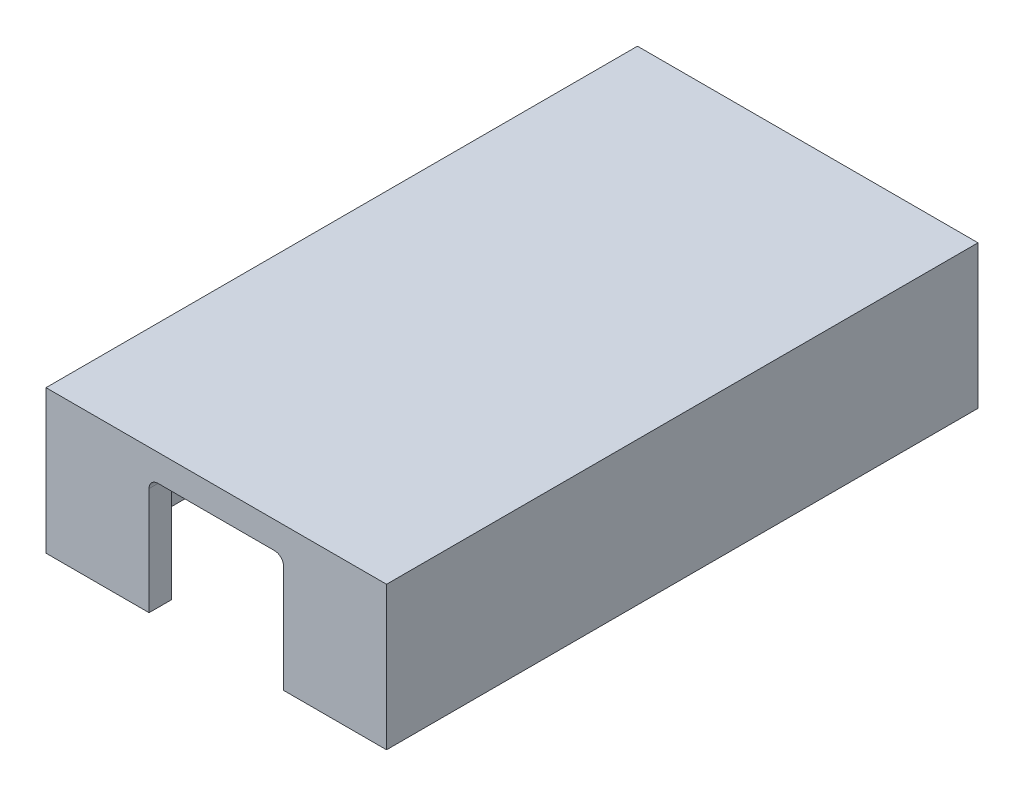
ISO-10303-21;
HEADER;
FILE_DESCRIPTION(('STEP AP214'),'2;1');
FILE_NAME('part.step','',(''),(''),'','','');
FILE_SCHEMA(('AUTOMOTIVE_DESIGN { 1 0 10303 214 1 1 1 1 }'));
ENDSEC;
DATA;
#1=APPLICATION_CONTEXT('core data for automotive mechanical design processes');
#2=APPLICATION_PROTOCOL_DEFINITION('international standard','automotive_design',2000,#1);
#3=PRODUCT_CONTEXT('',#1,'mechanical');
#4=PRODUCT('Part','Part','',(#3));
#5=PRODUCT_RELATED_PRODUCT_CATEGORY('part','',(#4));
#6=PRODUCT_DEFINITION_FORMATION('','',#4);
#7=PRODUCT_DEFINITION_CONTEXT('part definition',#1,'design');
#8=PRODUCT_DEFINITION('design','',#6,#7);
#9=PRODUCT_DEFINITION_SHAPE('','',#8);
#10=(LENGTH_UNIT() NAMED_UNIT(*) SI_UNIT(.MILLI.,.METRE.));
#11=(NAMED_UNIT(*) PLANE_ANGLE_UNIT() SI_UNIT($,.RADIAN.));
#12=(NAMED_UNIT(*) SI_UNIT($,.STERADIAN.) SOLID_ANGLE_UNIT());
#13=UNCERTAINTY_MEASURE_WITH_UNIT(LENGTH_MEASURE(1.E-05),#10,'distance_accuracy_value','');
#14=(GEOMETRIC_REPRESENTATION_CONTEXT(3) GLOBAL_UNCERTAINTY_ASSIGNED_CONTEXT((#13)) GLOBAL_UNIT_ASSIGNED_CONTEXT((#10,
#11,#12)) REPRESENTATION_CONTEXT('',''));
#15=CARTESIAN_POINT('',(0.,0.,0.));
#16=DIRECTION('',(0.,0.,1.));
#17=DIRECTION('',(1.,0.,0.));
#18=AXIS2_PLACEMENT_3D('',#15,#16,#17);
#19=CARTESIAN_POINT('',(16.5,-13.,-30.5));
#20=DIRECTION('',(-1.,0.,0.));
#21=DIRECTION('',(0.,0.,1.));
#22=AXIS2_PLACEMENT_3D('',#19,#20,#21);
#23=PLANE('',#22);
#24=DIRECTION('',(0.,1.,0.));
#25=VECTOR('',#24,1.);
#26=CARTESIAN_POINT('',(16.5,-13.,30.5));
#27=LINE('',#26,#25);
#28=CARTESIAN_POINT('',(16.5,-13.,30.5));
#29=VERTEX_POINT('',#28);
#30=CARTESIAN_POINT('',(16.5,-1.,30.5));
#31=VERTEX_POINT('',#30);
#32=EDGE_CURVE('E378',#29,#31,#27,.T.);
#33=ORIENTED_EDGE('',*,*,#32,.T.);
#34=DIRECTION('',(0.,0.,1.));
#35=VECTOR('',#34,1.);
#36=CARTESIAN_POINT('',(16.5,-0.999999999999999,-30.5));
#37=LINE('',#36,#35);
#38=CARTESIAN_POINT('',(16.5,-1.,-30.5));
#39=VERTEX_POINT('',#38);
#40=EDGE_CURVE('E439',#31,#39,#37,.F.);
#41=ORIENTED_EDGE('',*,*,#40,.T.);
#42=DIRECTION('',(0.,1.,0.));
#43=VECTOR('',#42,1.);
#44=CARTESIAN_POINT('',(16.5,-13.,-30.5));
#45=LINE('',#44,#43);
#46=CARTESIAN_POINT('',(16.5,-13.,-30.5));
#47=VERTEX_POINT('',#46);
#48=EDGE_CURVE('E381',#47,#39,#45,.T.);
#49=ORIENTED_EDGE('',*,*,#48,.F.);
#50=DIRECTION('',(0.,0.,1.));
#51=VECTOR('',#50,1.);
#52=CARTESIAN_POINT('',(16.5,-13.,-30.5));
#53=LINE('',#52,#51);
#54=CARTESIAN_POINT('',(16.5,-13.,-7.50000000000001));
#55=VERTEX_POINT('',#54);
#56=EDGE_CURVE('E361',#47,#55,#53,.T.);
#57=ORIENTED_EDGE('',*,*,#56,.T.);
#58=DIRECTION('',(0.,-1.,0.));
#59=VECTOR('',#58,1.);
#60=CARTESIAN_POINT('',(16.5,-13.,-7.5));
#61=LINE('',#60,#59);
#62=CARTESIAN_POINT('',(16.5,-11.5,-7.5));
#63=VERTEX_POINT('',#62);
#64=EDGE_CURVE('E254',#63,#55,#61,.T.);
#65=ORIENTED_EDGE('',*,*,#64,.F.);
#66=DIRECTION('',(0.,0.,-1.));
#67=VECTOR('',#66,1.);
#68=CARTESIAN_POINT('',(16.5,-11.5,-7.5));
#69=LINE('',#68,#67);
#70=CARTESIAN_POINT('',(16.5,-11.5,7.5));
#71=VERTEX_POINT('',#70);
#72=EDGE_CURVE('E287',#71,#63,#69,.T.);
#73=ORIENTED_EDGE('',*,*,#72,.F.);
#74=DIRECTION('',(0.,1.,0.));
#75=VECTOR('',#74,1.);
#76=CARTESIAN_POINT('',(16.5,-13.,7.5));
#77=LINE('',#76,#75);
#78=CARTESIAN_POINT('',(16.5,-13.,7.5));
#79=VERTEX_POINT('',#78);
#80=EDGE_CURVE('E294',#79,#71,#77,.T.);
#81=ORIENTED_EDGE('',*,*,#80,.F.);
#82=EDGE_CURVE('E360',#79,#29,#53,.T.);
#83=ORIENTED_EDGE('',*,*,#82,.T.);
#84=EDGE_LOOP('',(#33,#41,#49,#57,#65,#73,#81,#83));
#85=FACE_BOUND('',#84,.T.);
#86=ADVANCED_FACE('F32',(#85),#23,.T.);
#87=CARTESIAN_POINT('',(-19.,3.,-33.));
#88=DIRECTION('',(1.,0.,0.));
#89=DIRECTION('',(0.,0.,-1.));
#90=AXIS2_PLACEMENT_3D('',#87,#88,#89);
#91=PLANE('',#90);
#92=DIRECTION('',(0.,-1.,0.));
#93=VECTOR('',#92,1.);
#94=CARTESIAN_POINT('',(-19.,3.,-33.));
#95=LINE('',#94,#93);
#96=CARTESIAN_POINT('',(-19.,3.,-33.));
#97=VERTEX_POINT('',#96);
#98=CARTESIAN_POINT('',(-19.,-13.,-33.));
#99=VERTEX_POINT('',#98);
#100=EDGE_CURVE('E397',#97,#99,#95,.T.);
#101=ORIENTED_EDGE('',*,*,#100,.T.);
#102=DIRECTION('',(0.,0.,1.));
#103=VECTOR('',#102,1.);
#104=CARTESIAN_POINT('',(-19.,-13.,-33.));
#105=LINE('',#104,#103);
#106=CARTESIAN_POINT('',(-19.,-13.,33.));
#107=VERTEX_POINT('',#106);
#108=EDGE_CURVE('E330',#99,#107,#105,.T.);
#109=ORIENTED_EDGE('',*,*,#108,.T.);
#110=DIRECTION('',(0.,-1.,0.));
#111=VECTOR('',#110,1.);
#112=CARTESIAN_POINT('',(-19.,3.,33.));
#113=LINE('',#112,#111);
#114=CARTESIAN_POINT('',(-19.,3.,33.));
#115=VERTEX_POINT('',#114);
#116=EDGE_CURVE('E549',#115,#107,#113,.T.);
#117=ORIENTED_EDGE('',*,*,#116,.F.);
#118=DIRECTION('',(0.,0.,1.));
#119=VECTOR('',#118,1.);
#120=CARTESIAN_POINT('',(-19.,3.,-33.));
#121=LINE('',#120,#119);
#122=EDGE_CURVE('E387',#97,#115,#121,.T.);
#123=ORIENTED_EDGE('',*,*,#122,.F.);
#124=EDGE_LOOP('',(#101,#109,#117,#123));
#125=FACE_BOUND('',#124,.T.);
#126=ADVANCED_FACE('F610',(#125),#91,.F.);
#127=CARTESIAN_POINT('',(-19.,3.,33.));
#128=DIRECTION('',(0.,0.,-1.));
#129=DIRECTION('',(-1.,0.,0.));
#130=AXIS2_PLACEMENT_3D('',#127,#128,#129);
#131=PLANE('',#130);
#132=ORIENTED_EDGE('',*,*,#116,.T.);
#133=DIRECTION('',(1.,0.,0.));
#134=VECTOR('',#133,1.);
#135=CARTESIAN_POINT('',(-7.49999999999999,-13.,33.));
#136=LINE('',#135,#134);
#137=CARTESIAN_POINT('',(-7.49999999999999,-13.,33.));
#138=VERTEX_POINT('',#137);
#139=EDGE_CURVE('E308',#107,#138,#136,.T.);
#140=ORIENTED_EDGE('',*,*,#139,.T.);
#141=DIRECTION('',(0.,1.,0.));
#142=VECTOR('',#141,1.);
#143=CARTESIAN_POINT('',(-7.49999999999999,-13.,33.));
#144=LINE('',#143,#142);
#145=CARTESIAN_POINT('',(-7.49999999999999,-1.,33.));
#146=VERTEX_POINT('',#145);
#147=EDGE_CURVE('E333',#138,#146,#144,.T.);
#148=ORIENTED_EDGE('',*,*,#147,.T.);
#149=CARTESIAN_POINT('',(-6.49999999999999,-1.,33.));
#150=DIRECTION('',(0.,0.,-1.));
#151=DIRECTION('',(-1.,0.,0.));
#152=AXIS2_PLACEMENT_3D('',#149,#150,#151);
#153=CIRCLE('',#152,1.);
#154=CARTESIAN_POINT('',(-6.49999999999999,0.,33.));
#155=VERTEX_POINT('',#154);
#156=EDGE_CURVE('E11',#146,#155,#153,.T.);
#157=ORIENTED_EDGE('',*,*,#156,.T.);
#158=DIRECTION('',(1.,0.,0.));
#159=VECTOR('',#158,1.);
#160=CARTESIAN_POINT('',(-19.,0.,33.));
#161=LINE('',#160,#159);
#162=CARTESIAN_POINT('',(6.50000000000001,0.,33.));
#163=VERTEX_POINT('',#162);
#164=EDGE_CURVE('E403',#155,#163,#161,.T.);
#165=ORIENTED_EDGE('',*,*,#164,.T.);
#166=CARTESIAN_POINT('',(6.50000000000001,-1.,33.));
#167=DIRECTION('',(0.,0.,-1.));
#168=DIRECTION('',(-1.,0.,0.));
#169=AXIS2_PLACEMENT_3D('',#166,#167,#168);
#170=CIRCLE('',#169,1.);
#171=CARTESIAN_POINT('',(7.50000000000001,-1.,33.));
#172=VERTEX_POINT('',#171);
#173=EDGE_CURVE('E41',#163,#172,#170,.T.);
#174=ORIENTED_EDGE('',*,*,#173,.T.);
#175=DIRECTION('',(0.,1.,0.));
#176=VECTOR('',#175,1.);
#177=CARTESIAN_POINT('',(7.50000000000001,-13.,33.));
#178=LINE('',#177,#176);
#179=CARTESIAN_POINT('',(7.50000000000001,-13.,33.));
#180=VERTEX_POINT('',#179);
#181=EDGE_CURVE('E377',#180,#172,#178,.T.);
#182=ORIENTED_EDGE('',*,*,#181,.F.);
#183=DIRECTION('',(1.,0.,0.));
#184=VECTOR('',#183,1.);
#185=CARTESIAN_POINT('',(19.,-13.,33.));
#186=LINE('',#185,#184);
#187=CARTESIAN_POINT('',(19.,-13.,33.));
#188=VERTEX_POINT('',#187);
#189=EDGE_CURVE('E370',#180,#188,#186,.T.);
#190=ORIENTED_EDGE('',*,*,#189,.T.);
#191=DIRECTION('',(0.,-1.,0.));
#192=VECTOR('',#191,1.);
#193=CARTESIAN_POINT('',(19.,3.,33.));
#194=LINE('',#193,#192);
#195=CARTESIAN_POINT('',(19.,3.,33.));
#196=VERTEX_POINT('',#195);
#197=EDGE_CURVE('E547',#196,#188,#194,.T.);
#198=ORIENTED_EDGE('',*,*,#197,.F.);
#199=DIRECTION('',(1.,0.,0.));
#200=VECTOR('',#199,1.);
#201=CARTESIAN_POINT('',(-19.,3.,33.));
#202=LINE('',#201,#200);
#203=EDGE_CURVE('E390',#115,#196,#202,.T.);
#204=ORIENTED_EDGE('',*,*,#203,.F.);
#205=EDGE_LOOP('',(#132,#140,#148,#157,#165,#174,#182,#190,#198,#204));
#206=FACE_BOUND('',#205,.T.);
#207=ADVANCED_FACE('F491',(#206),#131,.F.);
#208=CARTESIAN_POINT('',(19.,3.,-33.));
#209=DIRECTION('',(-1.,0.,0.));
#210=DIRECTION('',(0.,0.,1.));
#211=AXIS2_PLACEMENT_3D('',#208,#209,#210);
#212=PLANE('',#211);
#213=ORIENTED_EDGE('',*,*,#197,.T.);
#214=DIRECTION('',(0.,0.,-1.));
#215=VECTOR('',#214,1.);
#216=CARTESIAN_POINT('',(19.,-13.,-33.));
#217=LINE('',#216,#215);
#218=CARTESIAN_POINT('',(19.,-13.,-33.));
#219=VERTEX_POINT('',#218);
#220=EDGE_CURVE('E337',#188,#219,#217,.T.);
#221=ORIENTED_EDGE('',*,*,#220,.T.);
#222=DIRECTION('',(0.,-1.,0.));
#223=VECTOR('',#222,1.);
#224=CARTESIAN_POINT('',(19.,3.,-33.));
#225=LINE('',#224,#223);
#226=CARTESIAN_POINT('',(19.,3.,-33.));
#227=VERTEX_POINT('',#226);
#228=EDGE_CURVE('E543',#227,#219,#225,.T.);
#229=ORIENTED_EDGE('',*,*,#228,.F.);
#230=DIRECTION('',(0.,0.,-1.));
#231=VECTOR('',#230,1.);
#232=CARTESIAN_POINT('',(19.,3.,-33.));
#233=LINE('',#232,#231);
#234=EDGE_CURVE('E393',#196,#227,#233,.T.);
#235=ORIENTED_EDGE('',*,*,#234,.F.);
#236=EDGE_LOOP('',(#213,#221,#229,#235));
#237=FACE_BOUND('',#236,.T.);
#238=ADVANCED_FACE('F604',(#237),#212,.F.);
#239=CARTESIAN_POINT('',(-19.,3.,-33.));
#240=DIRECTION('',(0.,0.,1.));
#241=DIRECTION('',(1.,0.,0.));
#242=AXIS2_PLACEMENT_3D('',#239,#240,#241);
#243=PLANE('',#242);
#244=ORIENTED_EDGE('',*,*,#228,.T.);
#245=DIRECTION('',(-1.,0.,0.));
#246=VECTOR('',#245,1.);
#247=CARTESIAN_POINT('',(19.,-13.,-33.));
#248=LINE('',#247,#246);
#249=CARTESIAN_POINT('',(2.5,-13.,-33.));
#250=VERTEX_POINT('',#249);
#251=EDGE_CURVE('E351',#219,#250,#248,.T.);
#252=ORIENTED_EDGE('',*,*,#251,.T.);
#253=DIRECTION('',(0.,1.,0.));
#254=VECTOR('',#253,1.);
#255=CARTESIAN_POINT('',(2.5,-13.,-33.));
#256=LINE('',#255,#254);
#257=CARTESIAN_POINT('',(2.5,-1.,-33.));
#258=VERTEX_POINT('',#257);
#259=EDGE_CURVE('E373',#250,#258,#256,.T.);
#260=ORIENTED_EDGE('',*,*,#259,.T.);
#261=CARTESIAN_POINT('',(1.5,-1.,-33.));
#262=DIRECTION('',(0.,0.,1.));
#263=DIRECTION('',(1.,0.,0.));
#264=AXIS2_PLACEMENT_3D('',#261,#262,#263);
#265=CIRCLE('',#264,1.);
#266=CARTESIAN_POINT('',(1.5,0.,-33.));
#267=VERTEX_POINT('',#266);
#268=EDGE_CURVE('E451',#258,#267,#265,.T.);
#269=ORIENTED_EDGE('',*,*,#268,.T.);
#270=DIRECTION('',(-1.,0.,0.));
#271=VECTOR('',#270,1.);
#272=CARTESIAN_POINT('',(-19.,0.,-33.));
#273=LINE('',#272,#271);
#274=CARTESIAN_POINT('',(-7.5,0.,-33.));
#275=VERTEX_POINT('',#274);
#276=EDGE_CURVE('E391',#267,#275,#273,.T.);
#277=ORIENTED_EDGE('',*,*,#276,.T.);
#278=CARTESIAN_POINT('',(-7.5,-1.,-33.));
#279=DIRECTION('',(0.,0.,1.));
#280=DIRECTION('',(1.,0.,0.));
#281=AXIS2_PLACEMENT_3D('',#278,#279,#280);
#282=CIRCLE('',#281,1.);
#283=CARTESIAN_POINT('',(-8.5,-1.,-33.));
#284=VERTEX_POINT('',#283);
#285=EDGE_CURVE('E449',#275,#284,#282,.T.);
#286=ORIENTED_EDGE('',*,*,#285,.T.);
#287=DIRECTION('',(0.,1.,0.));
#288=VECTOR('',#287,1.);
#289=CARTESIAN_POINT('',(-8.5,-13.,-33.));
#290=LINE('',#289,#288);
#291=CARTESIAN_POINT('',(-8.5,-13.,-33.));
#292=VERTEX_POINT('',#291);
#293=EDGE_CURVE('E334',#292,#284,#290,.T.);
#294=ORIENTED_EDGE('',*,*,#293,.F.);
#295=DIRECTION('',(-1.,0.,0.));
#296=VECTOR('',#295,1.);
#297=CARTESIAN_POINT('',(-8.5,-13.,-33.));
#298=LINE('',#297,#296);
#299=EDGE_CURVE('E327',#292,#99,#298,.T.);
#300=ORIENTED_EDGE('',*,*,#299,.T.);
#301=ORIENTED_EDGE('',*,*,#100,.F.);
#302=DIRECTION('',(-1.,0.,0.));
#303=VECTOR('',#302,1.);
#304=CARTESIAN_POINT('',(-19.,3.,-33.));
#305=LINE('',#304,#303);
#306=EDGE_CURVE('E395',#227,#97,#305,.T.);
#307=ORIENTED_EDGE('',*,*,#306,.F.);
#308=EDGE_LOOP('',(#244,#252,#260,#269,#277,#286,#294,#300,#301,#307));
#309=FACE_BOUND('',#308,.T.);
#310=ADVANCED_FACE('F516',(#309),#243,.F.);
#311=CARTESIAN_POINT('',(0.,3.,0.));
#312=DIRECTION('',(0.,1.,0.));
#313=DIRECTION('',(0.,0.,1.));
#314=AXIS2_PLACEMENT_3D('',#311,#312,#313);
#315=PLANE('',#314);
#316=ORIENTED_EDGE('',*,*,#122,.T.);
#317=ORIENTED_EDGE('',*,*,#203,.T.);
#318=ORIENTED_EDGE('',*,*,#234,.T.);
#319=ORIENTED_EDGE('',*,*,#306,.T.);
#320=EDGE_LOOP('',(#316,#317,#318,#319));
#321=FACE_BOUND('',#320,.T.);
#322=ADVANCED_FACE('F606',(#321),#315,.T.);
#323=CARTESIAN_POINT('',(0.,0.,0.));
#324=DIRECTION('',(0.,1.,0.));
#325=DIRECTION('',(0.,0.,1.));
#326=AXIS2_PLACEMENT_3D('',#323,#324,#325);
#327=PLANE('',#326);
#328=ORIENTED_EDGE('',*,*,#276,.F.);
#329=DIRECTION('',(0.,0.,1.));
#330=VECTOR('',#329,1.);
#331=CARTESIAN_POINT('',(1.5,0.,0.));
#332=LINE('',#331,#330);
#333=CARTESIAN_POINT('',(1.5,0.,-29.5));
#334=VERTEX_POINT('',#333);
#335=EDGE_CURVE('E428',#267,#334,#332,.T.);
#336=ORIENTED_EDGE('',*,*,#335,.T.);
#337=DIRECTION('',(1.,0.,0.));
#338=VECTOR('',#337,1.);
#339=CARTESIAN_POINT('',(0.,0.,-29.5));
#340=LINE('',#339,#338);
#341=CARTESIAN_POINT('',(15.5,0.,-29.5));
#342=VERTEX_POINT('',#341);
#343=EDGE_CURVE('E426',#334,#342,#340,.T.);
#344=ORIENTED_EDGE('',*,*,#343,.T.);
#345=DIRECTION('',(0.,0.,1.));
#346=VECTOR('',#345,1.);
#347=CARTESIAN_POINT('',(15.5,0.,0.));
#348=LINE('',#347,#346);
#349=CARTESIAN_POINT('',(15.5,0.,29.5));
#350=VERTEX_POINT('',#349);
#351=EDGE_CURVE('E424',#342,#350,#348,.T.);
#352=ORIENTED_EDGE('',*,*,#351,.T.);
#353=DIRECTION('',(-1.,0.,0.));
#354=VECTOR('',#353,1.);
#355=CARTESIAN_POINT('',(0.,0.,29.5));
#356=LINE('',#355,#354);
#357=CARTESIAN_POINT('',(6.50000000000001,0.,29.5));
#358=VERTEX_POINT('',#357);
#359=EDGE_CURVE('E420',#350,#358,#356,.T.);
#360=ORIENTED_EDGE('',*,*,#359,.T.);
#361=DIRECTION('',(0.,0.,1.));
#362=VECTOR('',#361,1.);
#363=CARTESIAN_POINT('',(6.50000000000001,0.,0.));
#364=LINE('',#363,#362);
#365=EDGE_CURVE('E422',#358,#163,#364,.T.);
#366=ORIENTED_EDGE('',*,*,#365,.T.);
#367=ORIENTED_EDGE('',*,*,#164,.F.);
#368=DIRECTION('',(0.,0.,-1.));
#369=VECTOR('',#368,1.);
#370=CARTESIAN_POINT('',(-6.49999999999999,0.,0.));
#371=LINE('',#370,#369);
#372=CARTESIAN_POINT('',(-6.49999999999999,0.,29.5));
#373=VERTEX_POINT('',#372);
#374=EDGE_CURVE('E408',#155,#373,#371,.T.);
#375=ORIENTED_EDGE('',*,*,#374,.T.);
#376=DIRECTION('',(-1.,0.,0.));
#377=VECTOR('',#376,1.);
#378=CARTESIAN_POINT('',(0.,0.,29.5));
#379=LINE('',#378,#377);
#380=CARTESIAN_POINT('',(-15.5,0.,29.5));
#381=VERTEX_POINT('',#380);
#382=EDGE_CURVE('E410',#373,#381,#379,.T.);
#383=ORIENTED_EDGE('',*,*,#382,.T.);
#384=DIRECTION('',(0.,0.,-1.));
#385=VECTOR('',#384,1.);
#386=CARTESIAN_POINT('',(-15.5,0.,0.));
#387=LINE('',#386,#385);
#388=CARTESIAN_POINT('',(-15.5,0.,-29.5));
#389=VERTEX_POINT('',#388);
#390=EDGE_CURVE('E413',#381,#389,#387,.T.);
#391=ORIENTED_EDGE('',*,*,#390,.T.);
#392=DIRECTION('',(1.,0.,0.));
#393=VECTOR('',#392,1.);
#394=CARTESIAN_POINT('',(0.,0.,-29.5));
#395=LINE('',#394,#393);
#396=CARTESIAN_POINT('',(-7.5,0.,-29.5));
#397=VERTEX_POINT('',#396);
#398=EDGE_CURVE('E415',#389,#397,#395,.T.);
#399=ORIENTED_EDGE('',*,*,#398,.T.);
#400=DIRECTION('',(0.,0.,-1.));
#401=VECTOR('',#400,1.);
#402=CARTESIAN_POINT('',(-7.5,0.,0.));
#403=LINE('',#402,#401);
#404=EDGE_CURVE('E417',#397,#275,#403,.T.);
#405=ORIENTED_EDGE('',*,*,#404,.T.);
#406=EDGE_LOOP('',(#328,#336,#344,#352,#360,#366,#367,#375,#383,#391,#399,#405));
#407=FACE_BOUND('',#406,.T.);
#408=ADVANCED_FACE('F488',(#407),#327,.F.);
#409=CARTESIAN_POINT('',(7.50000000000001,-13.,33.));
#410=DIRECTION('',(-1.,0.,0.));
#411=DIRECTION('',(0.,0.,1.));
#412=AXIS2_PLACEMENT_3D('',#409,#410,#411);
#413=PLANE('',#412);
#414=ORIENTED_EDGE('',*,*,#181,.T.);
#415=DIRECTION('',(0.,0.,1.));
#416=VECTOR('',#415,1.);
#417=CARTESIAN_POINT('',(7.50000000000001,-0.999999999999999,33.));
#418=LINE('',#417,#416);
#419=CARTESIAN_POINT('',(7.50000000000001,-1.,30.5));
#420=VERTEX_POINT('',#419);
#421=EDGE_CURVE('E441',#172,#420,#418,.F.);
#422=ORIENTED_EDGE('',*,*,#421,.T.);
#423=DIRECTION('',(0.,1.,0.));
#424=VECTOR('',#423,1.);
#425=CARTESIAN_POINT('',(7.50000000000001,-13.,30.5));
#426=LINE('',#425,#424);
#427=CARTESIAN_POINT('',(7.50000000000001,-13.,30.5));
#428=VERTEX_POINT('',#427);
#429=EDGE_CURVE('E374',#428,#420,#426,.T.);
#430=ORIENTED_EDGE('',*,*,#429,.F.);
#431=DIRECTION('',(0.,0.,1.));
#432=VECTOR('',#431,1.);
#433=CARTESIAN_POINT('',(7.50000000000001,-13.,33.));
#434=LINE('',#433,#432);
#435=EDGE_CURVE('E367',#428,#180,#434,.T.);
#436=ORIENTED_EDGE('',*,*,#435,.T.);
#437=EDGE_LOOP('',(#414,#422,#430,#436));
#438=FACE_BOUND('',#437,.T.);
#439=ADVANCED_FACE('F601',(#438),#413,.T.);
#440=CARTESIAN_POINT('',(16.5,-13.,30.5));
#441=DIRECTION('',(0.,0.,-1.));
#442=DIRECTION('',(-1.,0.,0.));
#443=AXIS2_PLACEMENT_3D('',#440,#441,#442);
#444=PLANE('',#443);
#445=ORIENTED_EDGE('',*,*,#429,.T.);
#446=DIRECTION('',(-1.,0.,0.));
#447=VECTOR('',#446,1.);
#448=CARTESIAN_POINT('',(16.5,-0.999999999999999,30.5));
#449=LINE('',#448,#447);
#450=EDGE_CURVE('E443',#420,#31,#449,.F.);
#451=ORIENTED_EDGE('',*,*,#450,.T.);
#452=ORIENTED_EDGE('',*,*,#32,.F.);
#453=DIRECTION('',(-1.,0.,0.));
#454=VECTOR('',#453,1.);
#455=CARTESIAN_POINT('',(16.5,-13.,30.5));
#456=LINE('',#455,#454);
#457=EDGE_CURVE('E364',#29,#428,#456,.T.);
#458=ORIENTED_EDGE('',*,*,#457,.T.);
#459=EDGE_LOOP('',(#445,#451,#452,#458));
#460=FACE_BOUND('',#459,.T.);
#461=ADVANCED_FACE('F599',(#460),#444,.T.);
#462=CARTESIAN_POINT('',(16.5,-13.,-30.5));
#463=DIRECTION('',(0.,0.,1.));
#464=DIRECTION('',(1.,0.,0.));
#465=AXIS2_PLACEMENT_3D('',#462,#463,#464);
#466=PLANE('',#465);
#467=ORIENTED_EDGE('',*,*,#48,.T.);
#468=DIRECTION('',(1.,0.,0.));
#469=VECTOR('',#468,1.);
#470=CARTESIAN_POINT('',(16.5,-0.999999999999999,-30.5));
#471=LINE('',#470,#469);
#472=CARTESIAN_POINT('',(2.5,-1.,-30.5));
#473=VERTEX_POINT('',#472);
#474=EDGE_CURVE('E437',#39,#473,#471,.F.);
#475=ORIENTED_EDGE('',*,*,#474,.T.);
#476=DIRECTION('',(0.,1.,0.));
#477=VECTOR('',#476,1.);
#478=CARTESIAN_POINT('',(2.5,-13.,-30.5));
#479=LINE('',#478,#477);
#480=CARTESIAN_POINT('',(2.5,-13.,-30.5));
#481=VERTEX_POINT('',#480);
#482=EDGE_CURVE('E384',#481,#473,#479,.T.);
#483=ORIENTED_EDGE('',*,*,#482,.F.);
#484=DIRECTION('',(1.,0.,0.));
#485=VECTOR('',#484,1.);
#486=CARTESIAN_POINT('',(16.5,-13.,-30.5));
#487=LINE('',#486,#485);
#488=EDGE_CURVE('E357',#481,#47,#487,.T.);
#489=ORIENTED_EDGE('',*,*,#488,.T.);
#490=EDGE_LOOP('',(#467,#475,#483,#489));
#491=FACE_BOUND('',#490,.T.);
#492=ADVANCED_FACE('F530',(#491),#466,.T.);
#493=CARTESIAN_POINT('',(2.5,-13.,-30.5));
#494=DIRECTION('',(-1.,0.,0.));
#495=DIRECTION('',(0.,0.,1.));
#496=AXIS2_PLACEMENT_3D('',#493,#494,#495);
#497=PLANE('',#496);
#498=ORIENTED_EDGE('',*,*,#482,.T.);
#499=DIRECTION('',(0.,0.,1.));
#500=VECTOR('',#499,1.);
#501=CARTESIAN_POINT('',(2.5,-0.999999999999999,-30.5));
#502=LINE('',#501,#500);
#503=EDGE_CURVE('E433',#473,#258,#502,.F.);
#504=ORIENTED_EDGE('',*,*,#503,.T.);
#505=ORIENTED_EDGE('',*,*,#259,.F.);
#506=DIRECTION('',(0.,0.,1.));
#507=VECTOR('',#506,1.);
#508=CARTESIAN_POINT('',(2.5,-13.,-30.5));
#509=LINE('',#508,#507);
#510=EDGE_CURVE('E354',#250,#481,#509,.T.);
#511=ORIENTED_EDGE('',*,*,#510,.T.);
#512=EDGE_LOOP('',(#498,#504,#505,#511));
#513=FACE_BOUND('',#512,.T.);
#514=ADVANCED_FACE('F533',(#513),#497,.T.);
#515=CARTESIAN_POINT('',(0.,-13.,0.));
#516=DIRECTION('',(0.,-1.,0.));
#517=DIRECTION('',(0.,0.,-1.));
#518=AXIS2_PLACEMENT_3D('',#515,#516,#517);
#519=PLANE('',#518);
#520=DIRECTION('',(1.,0.,0.));
#521=VECTOR('',#520,1.);
#522=CARTESIAN_POINT('',(15.,-13.,7.5));
#523=LINE('',#522,#521);
#524=CARTESIAN_POINT('',(16.,-13.,7.5));
#525=VERTEX_POINT('',#524);
#526=EDGE_CURVE('E304',#525,#79,#523,.T.);
#527=ORIENTED_EDGE('',*,*,#526,.F.);
#528=DIRECTION('',(0.,0.,1.));
#529=VECTOR('',#528,1.);
#530=CARTESIAN_POINT('',(16.,-13.,-7.5));
#531=LINE('',#530,#529);
#532=CARTESIAN_POINT('',(16.,-13.,-7.5));
#533=VERTEX_POINT('',#532);
#534=EDGE_CURVE('E572',#525,#533,#531,.F.);
#535=ORIENTED_EDGE('',*,*,#534,.T.);
#536=DIRECTION('',(1.,0.,0.));
#537=VECTOR('',#536,1.);
#538=CARTESIAN_POINT('',(15.,-13.,-7.5));
#539=LINE('',#538,#537);
#540=EDGE_CURVE('E306',#533,#55,#539,.T.);
#541=ORIENTED_EDGE('',*,*,#540,.T.);
#542=ORIENTED_EDGE('',*,*,#56,.F.);
#543=ORIENTED_EDGE('',*,*,#488,.F.);
#544=ORIENTED_EDGE('',*,*,#510,.F.);
#545=ORIENTED_EDGE('',*,*,#251,.F.);
#546=ORIENTED_EDGE('',*,*,#220,.F.);
#547=ORIENTED_EDGE('',*,*,#189,.F.);
#548=ORIENTED_EDGE('',*,*,#435,.F.);
#549=ORIENTED_EDGE('',*,*,#457,.F.);
#550=ORIENTED_EDGE('',*,*,#82,.F.);
#551=EDGE_LOOP('',(#527,#535,#541,#542,#543,#544,#545,#546,#547,#548,#549,#550));
#552=FACE_BOUND('',#551,.T.);
#553=ADVANCED_FACE('F538',(#552),#519,.T.);
#554=CARTESIAN_POINT('',(-8.5,-13.,-30.5));
#555=DIRECTION('',(1.,0.,0.));
#556=DIRECTION('',(0.,0.,-1.));
#557=AXIS2_PLACEMENT_3D('',#554,#555,#556);
#558=PLANE('',#557);
#559=ORIENTED_EDGE('',*,*,#293,.T.);
#560=DIRECTION('',(0.,0.,-1.));
#561=VECTOR('',#560,1.);
#562=CARTESIAN_POINT('',(-8.5,-0.999999999999999,-30.5));
#563=LINE('',#562,#561);
#564=CARTESIAN_POINT('',(-8.5,-1.,-30.5));
#565=VERTEX_POINT('',#564);
#566=EDGE_CURVE('E431',#284,#565,#563,.F.);
#567=ORIENTED_EDGE('',*,*,#566,.T.);
#568=DIRECTION('',(0.,1.,0.));
#569=VECTOR('',#568,1.);
#570=CARTESIAN_POINT('',(-8.5,-13.,-30.5));
#571=LINE('',#570,#569);
#572=CARTESIAN_POINT('',(-8.5,-13.,-30.5));
#573=VERTEX_POINT('',#572);
#574=EDGE_CURVE('E338',#573,#565,#571,.T.);
#575=ORIENTED_EDGE('',*,*,#574,.F.);
#576=DIRECTION('',(0.,0.,-1.));
#577=VECTOR('',#576,1.);
#578=CARTESIAN_POINT('',(-8.5,-13.,-30.5));
#579=LINE('',#578,#577);
#580=EDGE_CURVE('E324',#573,#292,#579,.T.);
#581=ORIENTED_EDGE('',*,*,#580,.T.);
#582=EDGE_LOOP('',(#559,#567,#575,#581));
#583=FACE_BOUND('',#582,.T.);
#584=ADVANCED_FACE('F636',(#583),#558,.T.);
#585=CARTESIAN_POINT('',(-8.5,-13.,-30.5));
#586=DIRECTION('',(0.,0.,1.));
#587=DIRECTION('',(1.,0.,0.));
#588=AXIS2_PLACEMENT_3D('',#585,#586,#587);
#589=PLANE('',#588);
#590=ORIENTED_EDGE('',*,*,#574,.T.);
#591=DIRECTION('',(1.,0.,0.));
#592=VECTOR('',#591,1.);
#593=CARTESIAN_POINT('',(-8.5,-0.999999999999999,-30.5));
#594=LINE('',#593,#592);
#595=CARTESIAN_POINT('',(-16.5,-1.,-30.5));
#596=VERTEX_POINT('',#595);
#597=EDGE_CURVE('E435',#565,#596,#594,.F.);
#598=ORIENTED_EDGE('',*,*,#597,.T.);
#599=DIRECTION('',(0.,1.,0.));
#600=VECTOR('',#599,1.);
#601=CARTESIAN_POINT('',(-16.5,-13.,-30.5));
#602=LINE('',#601,#600);
#603=CARTESIAN_POINT('',(-16.5,-13.,-30.5));
#604=VERTEX_POINT('',#603);
#605=EDGE_CURVE('E341',#604,#596,#602,.T.);
#606=ORIENTED_EDGE('',*,*,#605,.F.);
#607=DIRECTION('',(1.,0.,0.));
#608=VECTOR('',#607,1.);
#609=CARTESIAN_POINT('',(-8.5,-13.,-30.5));
#610=LINE('',#609,#608);
#611=EDGE_CURVE('E321',#604,#573,#610,.T.);
#612=ORIENTED_EDGE('',*,*,#611,.T.);
#613=EDGE_LOOP('',(#590,#598,#606,#612));
#614=FACE_BOUND('',#613,.T.);
#615=ADVANCED_FACE('F633',(#614),#589,.T.);
#616=CARTESIAN_POINT('',(-16.5,-13.,-30.5));
#617=DIRECTION('',(1.,0.,0.));
#618=DIRECTION('',(0.,0.,-1.));
#619=AXIS2_PLACEMENT_3D('',#616,#617,#618);
#620=PLANE('',#619);
#621=ORIENTED_EDGE('',*,*,#605,.T.);
#622=DIRECTION('',(0.,0.,-1.));
#623=VECTOR('',#622,1.);
#624=CARTESIAN_POINT('',(-16.5,-0.999999999999999,-30.5));
#625=LINE('',#624,#623);
#626=CARTESIAN_POINT('',(-16.5,-1.,30.5));
#627=VERTEX_POINT('',#626);
#628=EDGE_CURVE('E445',#596,#627,#625,.F.);
#629=ORIENTED_EDGE('',*,*,#628,.T.);
#630=DIRECTION('',(0.,1.,0.));
#631=VECTOR('',#630,1.);
#632=CARTESIAN_POINT('',(-16.5,-13.,30.5));
#633=LINE('',#632,#631);
#634=CARTESIAN_POINT('',(-16.5,-13.,30.5));
#635=VERTEX_POINT('',#634);
#636=EDGE_CURVE('E344',#635,#627,#633,.T.);
#637=ORIENTED_EDGE('',*,*,#636,.F.);
#638=DIRECTION('',(0.,0.,-1.));
#639=VECTOR('',#638,1.);
#640=CARTESIAN_POINT('',(-16.5,-13.,-30.5));
#641=LINE('',#640,#639);
#642=CARTESIAN_POINT('',(-16.5,-13.,7.49999999999999));
#643=VERTEX_POINT('',#642);
#644=EDGE_CURVE('E318',#635,#643,#641,.T.);
#645=ORIENTED_EDGE('',*,*,#644,.T.);
#646=DIRECTION('',(0.,1.,0.));
#647=VECTOR('',#646,1.);
#648=CARTESIAN_POINT('',(-16.5,-13.,7.5));
#649=LINE('',#648,#647);
#650=CARTESIAN_POINT('',(-16.5,-11.5,7.5));
#651=VERTEX_POINT('',#650);
#652=EDGE_CURVE('E264',#643,#651,#649,.T.);
#653=ORIENTED_EDGE('',*,*,#652,.T.);
#654=DIRECTION('',(0.,0.,-1.));
#655=VECTOR('',#654,1.);
#656=CARTESIAN_POINT('',(-16.5,-11.5,-7.5));
#657=LINE('',#656,#655);
#658=CARTESIAN_POINT('',(-16.5,-11.5,-7.5));
#659=VERTEX_POINT('',#658);
#660=EDGE_CURVE('E275',#651,#659,#657,.T.);
#661=ORIENTED_EDGE('',*,*,#660,.T.);
#662=DIRECTION('',(0.,-1.,0.));
#663=VECTOR('',#662,1.);
#664=CARTESIAN_POINT('',(-16.5,-13.,-7.5));
#665=LINE('',#664,#663);
#666=CARTESIAN_POINT('',(-16.5,-13.,-7.5));
#667=VERTEX_POINT('',#666);
#668=EDGE_CURVE('E250',#659,#667,#665,.T.);
#669=ORIENTED_EDGE('',*,*,#668,.T.);
#670=EDGE_CURVE('E317',#667,#604,#641,.T.);
#671=ORIENTED_EDGE('',*,*,#670,.T.);
#672=EDGE_LOOP('',(#621,#629,#637,#645,#653,#661,#669,#671));
#673=FACE_BOUND('',#672,.T.);
#674=ADVANCED_FACE('F623',(#673),#620,.T.);
#675=CARTESIAN_POINT('',(-7.49999999999999,-13.,30.5));
#676=DIRECTION('',(0.,0.,-1.));
#677=DIRECTION('',(-1.,0.,0.));
#678=AXIS2_PLACEMENT_3D('',#675,#676,#677);
#679=PLANE('',#678);
#680=ORIENTED_EDGE('',*,*,#636,.T.);
#681=DIRECTION('',(-1.,0.,0.));
#682=VECTOR('',#681,1.);
#683=CARTESIAN_POINT('',(-7.49999999999999,-0.999999999999999,30.5));
#684=LINE('',#683,#682);
#685=CARTESIAN_POINT('',(-7.49999999999999,-1.,30.5));
#686=VERTEX_POINT('',#685);
#687=EDGE_CURVE('E57',#627,#686,#684,.F.);
#688=ORIENTED_EDGE('',*,*,#687,.T.);
#689=DIRECTION('',(0.,1.,0.));
#690=VECTOR('',#689,1.);
#691=CARTESIAN_POINT('',(-7.49999999999999,-13.,30.5));
#692=LINE('',#691,#690);
#693=CARTESIAN_POINT('',(-7.49999999999999,-13.,30.5));
#694=VERTEX_POINT('',#693);
#695=EDGE_CURVE('E346',#694,#686,#692,.T.);
#696=ORIENTED_EDGE('',*,*,#695,.F.);
#697=DIRECTION('',(-1.,0.,0.));
#698=VECTOR('',#697,1.);
#699=CARTESIAN_POINT('',(-7.49999999999999,-13.,30.5));
#700=LINE('',#699,#698);
#701=EDGE_CURVE('E314',#694,#635,#700,.T.);
#702=ORIENTED_EDGE('',*,*,#701,.T.);
#703=EDGE_LOOP('',(#680,#688,#696,#702));
#704=FACE_BOUND('',#703,.T.);
#705=ADVANCED_FACE('F621',(#704),#679,.T.);
#706=CARTESIAN_POINT('',(-7.49999999999999,-13.,33.));
#707=DIRECTION('',(1.,0.,0.));
#708=DIRECTION('',(0.,0.,-1.));
#709=AXIS2_PLACEMENT_3D('',#706,#707,#708);
#710=PLANE('',#709);
#711=ORIENTED_EDGE('',*,*,#695,.T.);
#712=DIRECTION('',(0.,0.,-1.));
#713=VECTOR('',#712,1.);
#714=CARTESIAN_POINT('',(-7.49999999999999,-0.999999999999999,33.));
#715=LINE('',#714,#713);
#716=EDGE_CURVE('E49',#686,#146,#715,.F.);
#717=ORIENTED_EDGE('',*,*,#716,.T.);
#718=ORIENTED_EDGE('',*,*,#147,.F.);
#719=DIRECTION('',(0.,0.,-1.));
#720=VECTOR('',#719,1.);
#721=CARTESIAN_POINT('',(-7.49999999999999,-13.,33.));
#722=LINE('',#721,#720);
#723=EDGE_CURVE('E311',#138,#694,#722,.T.);
#724=ORIENTED_EDGE('',*,*,#723,.T.);
#725=EDGE_LOOP('',(#711,#717,#718,#724));
#726=FACE_BOUND('',#725,.T.);
#727=ADVANCED_FACE('F620',(#726),#710,.T.);
#728=CARTESIAN_POINT('',(0.,-13.,0.));
#729=DIRECTION('',(0.,1.,0.));
#730=DIRECTION('',(0.,0.,1.));
#731=AXIS2_PLACEMENT_3D('',#728,#729,#730);
#732=PLANE('',#731);
#733=DIRECTION('',(-1.,0.,0.));
#734=VECTOR('',#733,1.);
#735=CARTESIAN_POINT('',(-15.,-13.,-7.5));
#736=LINE('',#735,#734);
#737=CARTESIAN_POINT('',(-16.,-13.,-7.5));
#738=VERTEX_POINT('',#737);
#739=EDGE_CURVE('E271',#738,#667,#736,.T.);
#740=ORIENTED_EDGE('',*,*,#739,.F.);
#741=DIRECTION('',(0.,0.,1.));
#742=VECTOR('',#741,1.);
#743=CARTESIAN_POINT('',(-16.,-13.,0.));
#744=LINE('',#743,#742);
#745=CARTESIAN_POINT('',(-16.,-13.,7.5));
#746=VERTEX_POINT('',#745);
#747=EDGE_CURVE('E553',#738,#746,#744,.T.);
#748=ORIENTED_EDGE('',*,*,#747,.T.);
#749=DIRECTION('',(-1.,0.,0.));
#750=VECTOR('',#749,1.);
#751=CARTESIAN_POINT('',(-15.,-13.,7.5));
#752=LINE('',#751,#750);
#753=EDGE_CURVE('E280',#746,#643,#752,.T.);
#754=ORIENTED_EDGE('',*,*,#753,.T.);
#755=ORIENTED_EDGE('',*,*,#644,.F.);
#756=ORIENTED_EDGE('',*,*,#701,.F.);
#757=ORIENTED_EDGE('',*,*,#723,.F.);
#758=ORIENTED_EDGE('',*,*,#139,.F.);
#759=ORIENTED_EDGE('',*,*,#108,.F.);
#760=ORIENTED_EDGE('',*,*,#299,.F.);
#761=ORIENTED_EDGE('',*,*,#580,.F.);
#762=ORIENTED_EDGE('',*,*,#611,.F.);
#763=ORIENTED_EDGE('',*,*,#670,.F.);
#764=EDGE_LOOP('',(#740,#748,#754,#755,#756,#757,#758,#759,#760,#761,#762,#763));
#765=FACE_BOUND('',#764,.T.);
#766=ADVANCED_FACE('F616',(#765),#732,.F.);
#767=CARTESIAN_POINT('',(15.,-13.,-7.5));
#768=DIRECTION('',(0.,0.,1.));
#769=DIRECTION('',(1.,0.,0.));
#770=AXIS2_PLACEMENT_3D('',#767,#768,#769);
#771=PLANE('',#770);
#772=ORIENTED_EDGE('',*,*,#540,.F.);
#773=CARTESIAN_POINT('',(16.,-12.,-7.5));
#774=DIRECTION('',(0.,0.,1.));
#775=DIRECTION('',(1.,0.,0.));
#776=AXIS2_PLACEMENT_3D('',#773,#774,#775);
#777=CIRCLE('',#776,1.);
#778=CARTESIAN_POINT('',(15.,-12.,-7.5));
#779=VERTEX_POINT('',#778);
#780=EDGE_CURVE('E411',#533,#779,#777,.F.);
#781=ORIENTED_EDGE('',*,*,#780,.T.);
#782=DIRECTION('',(0.,-1.,0.));
#783=VECTOR('',#782,1.);
#784=CARTESIAN_POINT('',(15.,-13.,-7.5));
#785=LINE('',#784,#783);
#786=CARTESIAN_POINT('',(15.,-11.5,-7.5));
#787=VERTEX_POINT('',#786);
#788=EDGE_CURVE('E283',#787,#779,#785,.T.);
#789=ORIENTED_EDGE('',*,*,#788,.F.);
#790=DIRECTION('',(1.,0.,0.));
#791=VECTOR('',#790,1.);
#792=CARTESIAN_POINT('',(15.,-11.5,-7.5));
#793=LINE('',#792,#791);
#794=EDGE_CURVE('E291',#787,#63,#793,.T.);
#795=ORIENTED_EDGE('',*,*,#794,.T.);
#796=ORIENTED_EDGE('',*,*,#64,.T.);
#797=EDGE_LOOP('',(#772,#781,#789,#795,#796));
#798=FACE_BOUND('',#797,.T.);
#799=ADVANCED_FACE('F577',(#798),#771,.F.);
#800=CARTESIAN_POINT('',(15.,-13.,7.5));
#801=DIRECTION('',(0.,0.,-1.));
#802=DIRECTION('',(-1.,0.,0.));
#803=AXIS2_PLACEMENT_3D('',#800,#801,#802);
#804=PLANE('',#803);
#805=DIRECTION('',(0.,1.,0.));
#806=VECTOR('',#805,1.);
#807=CARTESIAN_POINT('',(15.,-13.,7.5));
#808=LINE('',#807,#806);
#809=CARTESIAN_POINT('',(15.,-12.,7.5));
#810=VERTEX_POINT('',#809);
#811=CARTESIAN_POINT('',(15.,-11.5,7.5));
#812=VERTEX_POINT('',#811);
#813=EDGE_CURVE('E286',#810,#812,#808,.T.);
#814=ORIENTED_EDGE('',*,*,#813,.F.);
#815=CARTESIAN_POINT('',(16.,-12.,7.5));
#816=DIRECTION('',(0.,0.,-1.));
#817=DIRECTION('',(-1.,0.,0.));
#818=AXIS2_PLACEMENT_3D('',#815,#816,#817);
#819=CIRCLE('',#818,1.);
#820=EDGE_CURVE('E570',#810,#525,#819,.F.);
#821=ORIENTED_EDGE('',*,*,#820,.T.);
#822=ORIENTED_EDGE('',*,*,#526,.T.);
#823=ORIENTED_EDGE('',*,*,#80,.T.);
#824=DIRECTION('',(1.,0.,0.));
#825=VECTOR('',#824,1.);
#826=CARTESIAN_POINT('',(15.,-11.5,7.5));
#827=LINE('',#826,#825);
#828=EDGE_CURVE('E301',#812,#71,#827,.T.);
#829=ORIENTED_EDGE('',*,*,#828,.F.);
#830=EDGE_LOOP('',(#814,#821,#822,#823,#829));
#831=FACE_BOUND('',#830,.T.);
#832=ADVANCED_FACE('F588',(#831),#804,.F.);
#833=CARTESIAN_POINT('',(15.,-11.5,-7.5));
#834=DIRECTION('',(0.,-1.,0.));
#835=DIRECTION('',(0.,0.,-1.));
#836=AXIS2_PLACEMENT_3D('',#833,#834,#835);
#837=PLANE('',#836);
#838=ORIENTED_EDGE('',*,*,#72,.T.);
#839=ORIENTED_EDGE('',*,*,#794,.F.);
#840=DIRECTION('',(0.,0.,-1.));
#841=VECTOR('',#840,1.);
#842=CARTESIAN_POINT('',(15.,-11.5,-7.5));
#843=LINE('',#842,#841);
#844=EDGE_CURVE('E289',#812,#787,#843,.T.);
#845=ORIENTED_EDGE('',*,*,#844,.F.);
#846=ORIENTED_EDGE('',*,*,#828,.T.);
#847=EDGE_LOOP('',(#838,#839,#845,#846));
#848=FACE_BOUND('',#847,.T.);
#849=ADVANCED_FACE('F597',(#848),#837,.F.);
#850=CARTESIAN_POINT('',(15.,0.,0.));
#851=DIRECTION('',(1.,0.,0.));
#852=DIRECTION('',(0.,0.,-1.));
#853=AXIS2_PLACEMENT_3D('',#850,#851,#852);
#854=PLANE('',#853);
#855=ORIENTED_EDGE('',*,*,#788,.T.);
#856=DIRECTION('',(0.,0.,1.));
#857=VECTOR('',#856,1.);
#858=CARTESIAN_POINT('',(15.,-12.,7.5));
#859=LINE('',#858,#857);
#860=EDGE_CURVE('E567',#779,#810,#859,.T.);
#861=ORIENTED_EDGE('',*,*,#860,.T.);
#862=ORIENTED_EDGE('',*,*,#813,.T.);
#863=ORIENTED_EDGE('',*,*,#844,.T.);
#864=EDGE_LOOP('',(#855,#861,#862,#863));
#865=FACE_BOUND('',#864,.T.);
#866=ADVANCED_FACE('F582',(#865),#854,.F.);
#867=CARTESIAN_POINT('',(-15.,-13.,-7.5));
#868=DIRECTION('',(0.,0.,-1.));
#869=DIRECTION('',(-1.,0.,0.));
#870=AXIS2_PLACEMENT_3D('',#867,#868,#869);
#871=PLANE('',#870);
#872=DIRECTION('',(0.,-1.,0.));
#873=VECTOR('',#872,1.);
#874=CARTESIAN_POINT('',(-15.,-13.,-7.5));
#875=LINE('',#874,#873);
#876=CARTESIAN_POINT('',(-15.,-11.5,-7.5));
#877=VERTEX_POINT('',#876);
#878=CARTESIAN_POINT('',(-15.,-12.,-7.5));
#879=VERTEX_POINT('',#878);
#880=EDGE_CURVE('E247',#877,#879,#875,.T.);
#881=ORIENTED_EDGE('',*,*,#880,.T.);
#882=CARTESIAN_POINT('',(-16.,-12.,-7.5));
#883=DIRECTION('',(0.,0.,-1.));
#884=DIRECTION('',(-1.,0.,0.));
#885=AXIS2_PLACEMENT_3D('',#882,#883,#884);
#886=CIRCLE('',#885,1.);
#887=EDGE_CURVE('E565',#879,#738,#886,.T.);
#888=ORIENTED_EDGE('',*,*,#887,.T.);
#889=ORIENTED_EDGE('',*,*,#739,.T.);
#890=ORIENTED_EDGE('',*,*,#668,.F.);
#891=DIRECTION('',(-1.,0.,0.));
#892=VECTOR('',#891,1.);
#893=CARTESIAN_POINT('',(-15.,-11.5,-7.5));
#894=LINE('',#893,#892);
#895=EDGE_CURVE('E244',#877,#659,#894,.T.);
#896=ORIENTED_EDGE('',*,*,#895,.F.);
#897=EDGE_LOOP('',(#881,#888,#889,#890,#896));
#898=FACE_BOUND('',#897,.T.);
#899=ADVANCED_FACE('F246',(#898),#871,.T.);
#900=CARTESIAN_POINT('',(-15.,-11.5,-7.5));
#901=DIRECTION('',(0.,1.,0.));
#902=DIRECTION('',(0.,0.,1.));
#903=AXIS2_PLACEMENT_3D('',#900,#901,#902);
#904=PLANE('',#903);
#905=ORIENTED_EDGE('',*,*,#660,.F.);
#906=DIRECTION('',(-1.,0.,0.));
#907=VECTOR('',#906,1.);
#908=CARTESIAN_POINT('',(-15.,-11.5,7.5));
#909=LINE('',#908,#907);
#910=CARTESIAN_POINT('',(-15.,-11.5,7.5));
#911=VERTEX_POINT('',#910);
#912=EDGE_CURVE('E255',#911,#651,#909,.T.);
#913=ORIENTED_EDGE('',*,*,#912,.F.);
#914=DIRECTION('',(0.,0.,-1.));
#915=VECTOR('',#914,1.);
#916=CARTESIAN_POINT('',(-15.,-11.5,-7.5));
#917=LINE('',#916,#915);
#918=EDGE_CURVE('E261',#911,#877,#917,.T.);
#919=ORIENTED_EDGE('',*,*,#918,.T.);
#920=ORIENTED_EDGE('',*,*,#895,.T.);
#921=EDGE_LOOP('',(#905,#913,#919,#920));
#922=FACE_BOUND('',#921,.T.);
#923=ADVANCED_FACE('F267',(#922),#904,.T.);
#924=CARTESIAN_POINT('',(-15.,-13.,7.5));
#925=DIRECTION('',(0.,0.,1.));
#926=DIRECTION('',(1.,0.,0.));
#927=AXIS2_PLACEMENT_3D('',#924,#925,#926);
#928=PLANE('',#927);
#929=ORIENTED_EDGE('',*,*,#753,.F.);
#930=CARTESIAN_POINT('',(-16.,-12.,7.5));
#931=DIRECTION('',(0.,0.,1.));
#932=DIRECTION('',(1.,0.,0.));
#933=AXIS2_PLACEMENT_3D('',#930,#931,#932);
#934=CIRCLE('',#933,1.);
#935=CARTESIAN_POINT('',(-15.,-12.,7.5));
#936=VERTEX_POINT('',#935);
#937=EDGE_CURVE('E562',#746,#936,#934,.T.);
#938=ORIENTED_EDGE('',*,*,#937,.T.);
#939=DIRECTION('',(0.,1.,0.));
#940=VECTOR('',#939,1.);
#941=CARTESIAN_POINT('',(-15.,-13.,7.5));
#942=LINE('',#941,#940);
#943=EDGE_CURVE('E269',#936,#911,#942,.T.);
#944=ORIENTED_EDGE('',*,*,#943,.T.);
#945=ORIENTED_EDGE('',*,*,#912,.T.);
#946=ORIENTED_EDGE('',*,*,#652,.F.);
#947=EDGE_LOOP('',(#929,#938,#944,#945,#946));
#948=FACE_BOUND('',#947,.T.);
#949=ADVANCED_FACE('F628',(#948),#928,.T.);
#950=CARTESIAN_POINT('',(-15.,0.,0.));
#951=DIRECTION('',(-1.,0.,0.));
#952=DIRECTION('',(0.,0.,-1.));
#953=AXIS2_PLACEMENT_3D('',#950,#951,#952);
#954=PLANE('',#953);
#955=ORIENTED_EDGE('',*,*,#943,.F.);
#956=DIRECTION('',(0.,0.,1.));
#957=VECTOR('',#956,1.);
#958=CARTESIAN_POINT('',(-15.,-12.,0.));
#959=LINE('',#958,#957);
#960=EDGE_CURVE('E263',#936,#879,#959,.F.);
#961=ORIENTED_EDGE('',*,*,#960,.T.);
#962=ORIENTED_EDGE('',*,*,#880,.F.);
#963=ORIENTED_EDGE('',*,*,#918,.F.);
#964=EDGE_LOOP('',(#955,#961,#962,#963));
#965=FACE_BOUND('',#964,.T.);
#966=ADVANCED_FACE('F260',(#965),#954,.F.);
#967=CARTESIAN_POINT('',(-16.,-12.,0.));
#968=DIRECTION('',(0.,0.,1.));
#969=DIRECTION('',(1.,0.,0.));
#970=AXIS2_PLACEMENT_3D('',#967,#968,#969);
#971=CYLINDRICAL_SURFACE('',#970,1.);
#972=ORIENTED_EDGE('',*,*,#887,.F.);
#973=ORIENTED_EDGE('',*,*,#960,.F.);
#974=ORIENTED_EDGE('',*,*,#937,.F.);
#975=ORIENTED_EDGE('',*,*,#747,.F.);
#976=EDGE_LOOP('',(#972,#973,#974,#975));
#977=FACE_BOUND('',#976,.T.);
#978=ADVANCED_FACE('F670',(#977),#971,.T.);
#979=CARTESIAN_POINT('',(16.,-12.,0.));
#980=DIRECTION('',(0.,0.,-1.));
#981=DIRECTION('',(-1.,0.,0.));
#982=AXIS2_PLACEMENT_3D('',#979,#980,#981);
#983=CYLINDRICAL_SURFACE('',#982,1.);
#984=ORIENTED_EDGE('',*,*,#780,.F.);
#985=ORIENTED_EDGE('',*,*,#534,.F.);
#986=ORIENTED_EDGE('',*,*,#820,.F.);
#987=ORIENTED_EDGE('',*,*,#860,.F.);
#988=EDGE_LOOP('',(#984,#985,#986,#987));
#989=FACE_BOUND('',#988,.T.);
#990=ADVANCED_FACE('F586',(#989),#983,.T.);
#991=CARTESIAN_POINT('',(-6.49999999999999,-1.,0.));
#992=DIRECTION('',(0.,0.,-1.));
#993=DIRECTION('',(-1.,0.,0.));
#994=AXIS2_PLACEMENT_3D('',#991,#992,#993);
#995=CYLINDRICAL_SURFACE('',#994,1.);
#996=ORIENTED_EDGE('',*,*,#156,.F.);
#997=ORIENTED_EDGE('',*,*,#716,.F.);
#998=CARTESIAN_POINT('',(-6.49999999999999,-1.,29.5));
#999=DIRECTION('',(-0.707106781186548,0.,-0.707106781186547));
#1000=DIRECTION('',(0.707106781186547,0.,-0.707106781186548));
#1001=AXIS2_PLACEMENT_3D('',#998,#999,#1000);
#1002=ELLIPSE('',#1001,1.4142135623731,1.);
#1003=EDGE_CURVE('E276',#373,#686,#1002,.F.);
#1004=ORIENTED_EDGE('',*,*,#1003,.F.);
#1005=ORIENTED_EDGE('',*,*,#374,.F.);
#1006=EDGE_LOOP('',(#996,#997,#1004,#1005));
#1007=FACE_BOUND('',#1006,.T.);
#1008=ADVANCED_FACE('F495',(#1007),#995,.F.);
#1009=CARTESIAN_POINT('',(0.,-1.,29.5));
#1010=DIRECTION('',(-1.,0.,0.));
#1011=DIRECTION('',(0.,0.,1.));
#1012=AXIS2_PLACEMENT_3D('',#1009,#1010,#1011);
#1013=CYLINDRICAL_SURFACE('',#1012,1.);
#1014=ORIENTED_EDGE('',*,*,#1003,.T.);
#1015=ORIENTED_EDGE('',*,*,#687,.F.);
#1016=CARTESIAN_POINT('',(-15.5,-1.,29.5));
#1017=DIRECTION('',(-0.707106781186548,0.,-0.707106781186547));
#1018=DIRECTION('',(0.707106781186547,0.,-0.707106781186548));
#1019=AXIS2_PLACEMENT_3D('',#1016,#1017,#1018);
#1020=ELLIPSE('',#1019,1.4142135623731,1.);
#1021=EDGE_CURVE('E460',#381,#627,#1020,.F.);
#1022=ORIENTED_EDGE('',*,*,#1021,.F.);
#1023=ORIENTED_EDGE('',*,*,#382,.F.);
#1024=EDGE_LOOP('',(#1014,#1015,#1022,#1023));
#1025=FACE_BOUND('',#1024,.T.);
#1026=ADVANCED_FACE('F502',(#1025),#1013,.F.);
#1027=CARTESIAN_POINT('',(-15.5,-1.,0.));
#1028=DIRECTION('',(0.,0.,-1.));
#1029=DIRECTION('',(-1.,0.,0.));
#1030=AXIS2_PLACEMENT_3D('',#1027,#1028,#1029);
#1031=CYLINDRICAL_SURFACE('',#1030,1.);
#1032=ORIENTED_EDGE('',*,*,#1021,.T.);
#1033=ORIENTED_EDGE('',*,*,#628,.F.);
#1034=CARTESIAN_POINT('',(-15.5,-1.,-29.5));
#1035=DIRECTION('',(0.707106781186548,0.,-0.707106781186547));
#1036=DIRECTION('',(0.707106781186547,0.,0.707106781186548));
#1037=AXIS2_PLACEMENT_3D('',#1034,#1035,#1036);
#1038=ELLIPSE('',#1037,1.4142135623731,1.);
#1039=EDGE_CURVE('E457',#389,#596,#1038,.F.);
#1040=ORIENTED_EDGE('',*,*,#1039,.F.);
#1041=ORIENTED_EDGE('',*,*,#390,.F.);
#1042=EDGE_LOOP('',(#1032,#1033,#1040,#1041));
#1043=FACE_BOUND('',#1042,.T.);
#1044=ADVANCED_FACE('F505',(#1043),#1031,.F.);
#1045=CARTESIAN_POINT('',(0.,-1.,-29.5));
#1046=DIRECTION('',(1.,0.,0.));
#1047=DIRECTION('',(0.,0.,-1.));
#1048=AXIS2_PLACEMENT_3D('',#1045,#1046,#1047);
#1049=CYLINDRICAL_SURFACE('',#1048,1.);
#1050=ORIENTED_EDGE('',*,*,#1039,.T.);
#1051=ORIENTED_EDGE('',*,*,#597,.F.);
#1052=CARTESIAN_POINT('',(-7.5,-1.,-29.5));
#1053=DIRECTION('',(0.707106781186548,0.,-0.707106781186547));
#1054=DIRECTION('',(0.707106781186547,0.,0.707106781186548));
#1055=AXIS2_PLACEMENT_3D('',#1052,#1053,#1054);
#1056=ELLIPSE('',#1055,1.4142135623731,1.);
#1057=EDGE_CURVE('E454',#397,#565,#1056,.F.);
#1058=ORIENTED_EDGE('',*,*,#1057,.F.);
#1059=ORIENTED_EDGE('',*,*,#398,.F.);
#1060=EDGE_LOOP('',(#1050,#1051,#1058,#1059));
#1061=FACE_BOUND('',#1060,.T.);
#1062=ADVANCED_FACE('F510',(#1061),#1049,.F.);
#1063=CARTESIAN_POINT('',(-7.5,-1.,0.));
#1064=DIRECTION('',(0.,0.,-1.));
#1065=DIRECTION('',(-1.,0.,0.));
#1066=AXIS2_PLACEMENT_3D('',#1063,#1064,#1065);
#1067=CYLINDRICAL_SURFACE('',#1066,1.);
#1068=ORIENTED_EDGE('',*,*,#1057,.T.);
#1069=ORIENTED_EDGE('',*,*,#566,.F.);
#1070=ORIENTED_EDGE('',*,*,#285,.F.);
#1071=ORIENTED_EDGE('',*,*,#404,.F.);
#1072=EDGE_LOOP('',(#1068,#1069,#1070,#1071));
#1073=FACE_BOUND('',#1072,.T.);
#1074=ADVANCED_FACE('F638',(#1073),#1067,.F.);
#1075=CARTESIAN_POINT('',(6.50000000000001,-1.,0.));
#1076=DIRECTION('',(0.,0.,1.));
#1077=DIRECTION('',(1.,0.,0.));
#1078=AXIS2_PLACEMENT_3D('',#1075,#1076,#1077);
#1079=CYLINDRICAL_SURFACE('',#1078,1.);
#1080=ORIENTED_EDGE('',*,*,#173,.F.);
#1081=ORIENTED_EDGE('',*,*,#365,.F.);
#1082=CARTESIAN_POINT('',(6.50000000000001,-1.,29.5));
#1083=DIRECTION('',(-0.707106781186548,0.,0.707106781186547));
#1084=DIRECTION('',(-0.707106781186547,0.,-0.707106781186548));
#1085=AXIS2_PLACEMENT_3D('',#1082,#1083,#1084);
#1086=ELLIPSE('',#1085,1.4142135623731,1.);
#1087=EDGE_CURVE('E36',#420,#358,#1086,.T.);
#1088=ORIENTED_EDGE('',*,*,#1087,.F.);
#1089=ORIENTED_EDGE('',*,*,#421,.F.);
#1090=EDGE_LOOP('',(#1080,#1081,#1088,#1089));
#1091=FACE_BOUND('',#1090,.T.);
#1092=ADVANCED_FACE('F34',(#1091),#1079,.F.);
#1093=CARTESIAN_POINT('',(0.,-1.,29.5));
#1094=DIRECTION('',(-1.,0.,0.));
#1095=DIRECTION('',(0.,0.,1.));
#1096=AXIS2_PLACEMENT_3D('',#1093,#1094,#1095);
#1097=CYLINDRICAL_SURFACE('',#1096,1.);
#1098=ORIENTED_EDGE('',*,*,#1087,.T.);
#1099=ORIENTED_EDGE('',*,*,#359,.F.);
#1100=CARTESIAN_POINT('',(15.5,-1.,29.5));
#1101=DIRECTION('',(-0.707106781186548,0.,0.707106781186547));
#1102=DIRECTION('',(0.707106781186547,0.,0.707106781186548));
#1103=AXIS2_PLACEMENT_3D('',#1100,#1101,#1102);
#1104=ELLIPSE('',#1103,1.4142135623731,1.);
#1105=EDGE_CURVE('E469',#31,#350,#1104,.T.);
#1106=ORIENTED_EDGE('',*,*,#1105,.F.);
#1107=ORIENTED_EDGE('',*,*,#450,.F.);
#1108=EDGE_LOOP('',(#1098,#1099,#1106,#1107));
#1109=FACE_BOUND('',#1108,.T.);
#1110=ADVANCED_FACE('F480',(#1109),#1097,.F.);
#1111=CARTESIAN_POINT('',(15.5,-1.,0.));
#1112=DIRECTION('',(0.,0.,1.));
#1113=DIRECTION('',(1.,0.,0.));
#1114=AXIS2_PLACEMENT_3D('',#1111,#1112,#1113);
#1115=CYLINDRICAL_SURFACE('',#1114,1.);
#1116=ORIENTED_EDGE('',*,*,#1105,.T.);
#1117=ORIENTED_EDGE('',*,*,#351,.F.);
#1118=CARTESIAN_POINT('',(15.5,-1.,-29.5));
#1119=DIRECTION('',(0.707106781186548,0.,0.707106781186547));
#1120=DIRECTION('',(0.707106781186547,0.,-0.707106781186548));
#1121=AXIS2_PLACEMENT_3D('',#1118,#1119,#1120);
#1122=ELLIPSE('',#1121,1.4142135623731,1.);
#1123=EDGE_CURVE('E467',#39,#342,#1122,.T.);
#1124=ORIENTED_EDGE('',*,*,#1123,.F.);
#1125=ORIENTED_EDGE('',*,*,#40,.F.);
#1126=EDGE_LOOP('',(#1116,#1117,#1124,#1125));
#1127=FACE_BOUND('',#1126,.T.);
#1128=ADVANCED_FACE('F526',(#1127),#1115,.F.);
#1129=CARTESIAN_POINT('',(0.,-1.,-29.5));
#1130=DIRECTION('',(1.,0.,0.));
#1131=DIRECTION('',(0.,0.,-1.));
#1132=AXIS2_PLACEMENT_3D('',#1129,#1130,#1131);
#1133=CYLINDRICAL_SURFACE('',#1132,1.);
#1134=ORIENTED_EDGE('',*,*,#1123,.T.);
#1135=ORIENTED_EDGE('',*,*,#343,.F.);
#1136=CARTESIAN_POINT('',(1.5,-1.,-29.5));
#1137=DIRECTION('',(0.707106781186548,0.,0.707106781186547));
#1138=DIRECTION('',(0.707106781186547,0.,-0.707106781186548));
#1139=AXIS2_PLACEMENT_3D('',#1136,#1137,#1138);
#1140=ELLIPSE('',#1139,1.4142135623731,1.);
#1141=EDGE_CURVE('E465',#473,#334,#1140,.T.);
#1142=ORIENTED_EDGE('',*,*,#1141,.F.);
#1143=ORIENTED_EDGE('',*,*,#474,.F.);
#1144=EDGE_LOOP('',(#1134,#1135,#1142,#1143));
#1145=FACE_BOUND('',#1144,.T.);
#1146=ADVANCED_FACE('F528',(#1145),#1133,.F.);
#1147=CARTESIAN_POINT('',(1.5,-1.,0.));
#1148=DIRECTION('',(0.,0.,1.));
#1149=DIRECTION('',(1.,0.,0.));
#1150=AXIS2_PLACEMENT_3D('',#1147,#1148,#1149);
#1151=CYLINDRICAL_SURFACE('',#1150,1.);
#1152=ORIENTED_EDGE('',*,*,#268,.F.);
#1153=ORIENTED_EDGE('',*,*,#503,.F.);
#1154=ORIENTED_EDGE('',*,*,#1141,.T.);
#1155=ORIENTED_EDGE('',*,*,#335,.F.);
#1156=EDGE_LOOP('',(#1152,#1153,#1154,#1155));
#1157=FACE_BOUND('',#1156,.T.);
#1158=ADVANCED_FACE('F521',(#1157),#1151,.F.);
#1159=CLOSED_SHELL('',(#86,#126,#207,#238,#310,#322,#408,#439,#461,#492,#514,#553,#584,#615,
#674,#705,#727,#766,#799,#832,#849,#866,#899,#923,#949,#966,#978,#990,#1008,#1026,#1044,#1062,
#1074,#1092,#1110,#1128,#1146,#1158));
#1160=MANIFOLD_SOLID_BREP('B2',#1159);
#1161=ADVANCED_BREP_SHAPE_REPRESENTATION('',(#18,#1160),#14);
#1162=SHAPE_DEFINITION_REPRESENTATION(#9,#1161);
ENDSEC;
END-ISO-10303-21;
